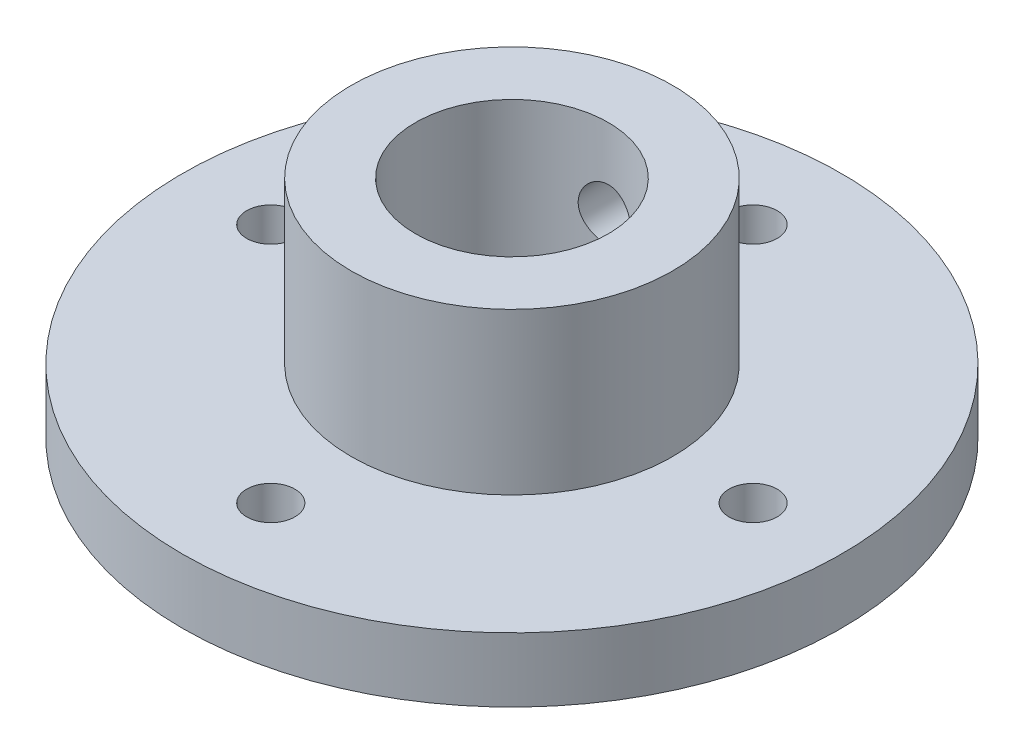
ISO-10303-21;
HEADER;
FILE_DESCRIPTION(('STEP AP214'),'2;1');
FILE_NAME('part.step','',(''),(''),'','','');
FILE_SCHEMA(('AUTOMOTIVE_DESIGN { 1 0 10303 214 1 1 1 1 }'));
ENDSEC;
DATA;
#1=APPLICATION_CONTEXT('core data for automotive mechanical design processes');
#2=APPLICATION_PROTOCOL_DEFINITION('international standard','automotive_design',2000,#1);
#3=PRODUCT_CONTEXT('',#1,'mechanical');
#4=PRODUCT('Part','Part','',(#3));
#5=PRODUCT_RELATED_PRODUCT_CATEGORY('part','',(#4));
#6=PRODUCT_DEFINITION_FORMATION('','',#4);
#7=PRODUCT_DEFINITION_CONTEXT('part definition',#1,'design');
#8=PRODUCT_DEFINITION('design','',#6,#7);
#9=PRODUCT_DEFINITION_SHAPE('','',#8);
#10=(LENGTH_UNIT() NAMED_UNIT(*) SI_UNIT(.MILLI.,.METRE.));
#11=(NAMED_UNIT(*) PLANE_ANGLE_UNIT() SI_UNIT($,.RADIAN.));
#12=(NAMED_UNIT(*) SI_UNIT($,.STERADIAN.) SOLID_ANGLE_UNIT());
#13=UNCERTAINTY_MEASURE_WITH_UNIT(LENGTH_MEASURE(1.E-05),#10,'distance_accuracy_value','');
#14=(GEOMETRIC_REPRESENTATION_CONTEXT(3) GLOBAL_UNCERTAINTY_ASSIGNED_CONTEXT((#13)) GLOBAL_UNIT_ASSIGNED_CONTEXT((#10,
#11,#12)) REPRESENTATION_CONTEXT('',''));
#15=CARTESIAN_POINT('',(0.,0.,0.));
#16=DIRECTION('',(0.,0.,1.));
#17=DIRECTION('',(1.,0.,0.));
#18=AXIS2_PLACEMENT_3D('',#15,#16,#17);
#19=CARTESIAN_POINT('',(0.,0.,-10.));
#20=DIRECTION('',(0.,-1.,0.));
#21=DIRECTION('',(0.,0.,-1.));
#22=AXIS2_PLACEMENT_3D('',#19,#20,#21);
#23=PLANE('',#22);
#24=CARTESIAN_POINT('',(0.,0.,0.));
#25=DIRECTION('',(0.,1.,0.));
#26=DIRECTION('',(0.,0.,1.));
#27=AXIS2_PLACEMENT_3D('',#24,#25,#26);
#28=CIRCLE('',#27,6.);
#29=CARTESIAN_POINT('',(0.,0.,6.));
#30=VERTEX_POINT('',#29);
#31=EDGE_CURVE('E10',#30,#30,#28,.T.);
#32=ORIENTED_EDGE('',*,*,#31,.F.);
#33=EDGE_LOOP('',(#32));
#34=FACE_BOUND('',#33,.T.);
#35=CARTESIAN_POINT('',(0.,0.,0.));
#36=DIRECTION('',(0.,1.,0.));
#37=DIRECTION('',(0.,0.,1.));
#38=AXIS2_PLACEMENT_3D('',#35,#36,#37);
#39=CIRCLE('',#38,10.);
#40=CARTESIAN_POINT('',(0.,0.,10.));
#41=VERTEX_POINT('',#40);
#42=EDGE_CURVE('E61',#41,#41,#39,.T.);
#43=ORIENTED_EDGE('',*,*,#42,.T.);
#44=EDGE_LOOP('',(#43));
#45=FACE_BOUND('',#44,.T.);
#46=ADVANCED_FACE('F39',(#34,#45),#23,.F.);
#47=CARTESIAN_POINT('',(0.,12.4624704371306,0.));
#48=DIRECTION('',(0.,1.,0.));
#49=DIRECTION('',(0.,0.,1.));
#50=AXIS2_PLACEMENT_3D('',#47,#48,#49);
#51=CYLINDRICAL_SURFACE('',#50,6.);
#52=CARTESIAN_POINT('',(-1.64999999999999,-5.,-5.76866535690883));
#53=CARTESIAN_POINT('',(-1.64999803744471,-4.90921955335826,-5.76866681542244));
#54=CARTESIAN_POINT('',(-1.64248258154127,-4.81841876938433,-5.77083168489651));
#55=CARTESIAN_POINT('',(-1.6126811316083,-4.63944729227742,-5.77922931898767));
#56=CARTESIAN_POINT('',(-1.59038833565188,-4.55127782986673,-5.78546395687622));
#57=CARTESIAN_POINT('',(-1.53182668713213,-4.38018421281183,-5.80124279590021));
#58=CARTESIAN_POINT('',(-1.49557833657747,-4.29725257039649,-5.81078214006462));
#59=CARTESIAN_POINT('',(-1.41019959185369,-4.1386327818451,-5.83208926824762));
#60=CARTESIAN_POINT('',(-1.36106796655277,-4.06294532891123,-5.84385726520744));
#61=CARTESIAN_POINT('',(-1.24991964518897,-3.91894953768283,-5.8686465288998));
#62=CARTESIAN_POINT('',(-1.18762153463159,-3.85086238877202,-5.88169112663028));
#63=CARTESIAN_POINT('',(-1.05251338107008,-3.72595879824099,-5.90736293037452));
#64=CARTESIAN_POINT('',(-0.97970219058191,-3.66914358854209,-5.91999009064059));
#65=CARTESIAN_POINT('',(-0.824091417921738,-3.56746519622699,-5.94366575662943));
#66=CARTESIAN_POINT('',(-0.741142186315799,-3.52282326362093,-5.9546835378627));
#67=CARTESIAN_POINT('',(-0.568561338575518,-3.44820386122524,-5.9736305376139));
#68=CARTESIAN_POINT('',(-0.47893092704165,-3.41822375527837,-5.98156031129505));
#69=CARTESIAN_POINT('',(-0.297842110789113,-3.37449875531736,-5.99327282902113));
#70=CARTESIAN_POINT('',(-0.206480953697204,-3.36037728398331,-5.99715160352105));
#71=CARTESIAN_POINT('',(-0.0226094627200603,-3.34758420132033,-6.00066142983201));
#72=CARTESIAN_POINT('',(0.0699006641776066,-3.34890984638382,-6.00029323595966));
#73=CARTESIAN_POINT('',(0.250818004668655,-3.36671114639084,-5.99542038051176));
#74=CARTESIAN_POINT('',(0.339268726185948,-3.38277972798329,-5.9910268682886));
#75=CARTESIAN_POINT('',(0.512166240031458,-3.42895138459311,-5.97872912336679));
#76=CARTESIAN_POINT('',(0.596612796751148,-3.45905528433459,-5.97082468436519));
#77=CARTESIAN_POINT('',(0.76012676990918,-3.53274614554669,-5.95223107363847));
#78=CARTESIAN_POINT('',(0.839129261966644,-3.57646980011385,-5.94151385162518));
#79=CARTESIAN_POINT('',(0.988812528588859,-3.67605339164663,-5.91844520458616));
#80=CARTESIAN_POINT('',(1.05949158844747,-3.73191582259505,-5.90609344393908));
#81=CARTESIAN_POINT('',(1.19295184933328,-3.85634061131932,-5.88061532945822));
#82=CARTESIAN_POINT('',(1.25540056574357,-3.92525754558751,-5.86747685059754));
#83=CARTESIAN_POINT('',(1.36793848619848,-4.07272042191697,-5.84226662316507));
#84=CARTESIAN_POINT('',(1.41802683438026,-4.15126703019764,-5.83019494849859));
#85=CARTESIAN_POINT('',(1.50469703763151,-4.31651707691904,-5.80843406835838));
#86=CARTESIAN_POINT('',(1.54118305341272,-4.40327318726382,-5.79876192329638));
#87=CARTESIAN_POINT('',(1.59894009136597,-4.5820216149048,-5.78310436235825));
#88=CARTESIAN_POINT('',(1.62021516432519,-4.67401253108294,-5.77711796499911));
#89=CARTESIAN_POINT('',(1.6463617832479,-4.85749641079511,-5.76972035320552));
#90=CARTESIAN_POINT('',(1.65173157694039,-4.94891284793571,-5.76817022285768));
#91=CARTESIAN_POINT('',(1.64729247824813,-5.13133853039988,-5.76943959387622));
#92=CARTESIAN_POINT('',(1.63748531887186,-5.2223478210242,-5.77225859634513));
#93=CARTESIAN_POINT('',(1.60341110080102,-5.39941887867532,-5.78181388299926));
#94=CARTESIAN_POINT('',(1.57944858294857,-5.48554414327791,-5.78846759511703));
#95=CARTESIAN_POINT('',(1.51808880834984,-5.6525516832155,-5.80486075000444));
#96=CARTESIAN_POINT('',(1.48068971625608,-5.73343324051216,-5.81460061430066));
#97=CARTESIAN_POINT('',(1.39252303885361,-5.8897280941801,-5.83634995588392));
#98=CARTESIAN_POINT('',(1.3414656422839,-5.96497115812137,-5.84840681329183));
#99=CARTESIAN_POINT('',(1.22778724402409,-6.10600436259986,-5.87332256443653));
#100=CARTESIAN_POINT('',(1.16516392562851,-6.17179260459153,-5.88618161851454));
#101=CARTESIAN_POINT('',(1.02781750590111,-6.29414335503752,-5.91173499394533));
#102=CARTESIAN_POINT('',(0.952779703449051,-6.35035698500714,-5.92441187573805));
#103=CARTESIAN_POINT('',(0.794045946471825,-6.44939303044249,-5.94776568995451));
#104=CARTESIAN_POINT('',(0.710350452233261,-6.49221615732852,-5.95844272861526));
#105=CARTESIAN_POINT('',(0.53726501835387,-6.56285441331322,-5.97652506377789));
#106=CARTESIAN_POINT('',(0.447923954411465,-6.59078270093573,-5.98395494908837));
#107=CARTESIAN_POINT('',(0.265580317975261,-6.63115951696826,-5.99481425560821));
#108=CARTESIAN_POINT('',(0.172578617937351,-6.64361171109341,-5.99824462414353));
#109=CARTESIAN_POINT('',(-0.0111958773090363,-6.65244119041157,-6.00067051691051));
#110=CARTESIAN_POINT('',(-0.101942634810784,-6.64932873226352,-5.99980681919578));
#111=CARTESIAN_POINT('',(-0.281569554656668,-6.6283104181902,-5.99406321514946));
#112=CARTESIAN_POINT('',(-0.370449795011795,-6.61040518179519,-5.98918347701204));
#113=CARTESIAN_POINT('',(-0.543165745839329,-6.56060523911145,-5.97598710157647));
#114=CARTESIAN_POINT('',(-0.627035168123876,-6.52881985190943,-5.9676973503156));
#115=CARTESIAN_POINT('',(-0.788297966420385,-6.45225916736823,-5.94854501555121));
#116=CARTESIAN_POINT('',(-0.865690389200812,-6.40748196231652,-5.93768205424174));
#117=CARTESIAN_POINT('',(-1.01415403207421,-6.30474796401359,-5.91416124461071));
#118=CARTESIAN_POINT('',(-1.08498744614407,-6.24645711073664,-5.90146164079605));
#119=CARTESIAN_POINT('',(-1.21603947801471,-6.1189762735603,-5.87585872928397));
#120=CARTESIAN_POINT('',(-1.27625523789271,-6.04978336464786,-5.86295536775691));
#121=CARTESIAN_POINT('',(-1.38578701268236,-5.90048219479949,-5.83805027961809));
#122=CARTESIAN_POINT('',(-1.43480949541505,-5.82015333678291,-5.82607732195824));
#123=CARTESIAN_POINT('',(-1.51858609627287,-5.65207439398107,-5.80480632889601));
#124=CARTESIAN_POINT('',(-1.55334897834328,-5.56432890757189,-5.79550665155144));
#125=CARTESIAN_POINT('',(-1.60340195745889,-5.39750366779767,-5.78183943348555));
#126=CARTESIAN_POINT('',(-1.62083357797552,-5.31910375198116,-5.77694065884767));
#127=CARTESIAN_POINT('',(-1.64413270596965,-5.16047435965551,-5.77035318708946));
#128=CARTESIAN_POINT('',(-1.65000173479532,-5.08024512524438,-5.76866406765974));
#129=CARTESIAN_POINT('',(-1.64999999999999,-5.,-5.76866535690883));
#130=B_SPLINE_CURVE_WITH_KNOTS('',3,(#52,#53,#54,#55,#56,#57,#58,#59,#60,#61,#62,#63,#64,#65,
#66,#67,#68,#69,#70,#71,#72,#73,#74,#75,#76,#77,#78,#79,#80,#81,#82,#83,#84,#85,#86,#87,#88,#89,
#90,#91,#92,#93,#94,#95,#96,#97,#98,#99,#100,#101,#102,#103,#104,#105,#106,#107,#108,#109,#110,
#111,#112,#113,#114,#115,#116,#117,#118,#119,#120,#121,#122,#123,#124,#125,#126,#127,#128,#129),
.UNSPECIFIED.,.T.,.F.,(4,2,2,2,2,2,2,2,2,2,2,2,2,2,2,2,2,2,2,2,2,2,2,2,2,2,2,2,2,2,2,2,2,2,2,2,
2,2,4),(0.,0.272046051104014,0.544217410515628,0.815990441281181,1.08778945227587,
1.36612384486571,1.64448864015853,1.92761862185041,2.21069767879603,2.48690242321261,
2.76305811084344,3.031810994421,3.30057967207717,3.57213780160765,3.84375177719014,
4.12421818647042,4.40470401050124,4.68713031851456,4.96948138625908,5.24288876991939,
5.51626493635488,5.78396348444835,6.05169861230968,6.32564040616626,6.59963713140789,
6.88212071608132,7.16458929021232,7.44488018041164,7.72510466738723,7.99620396443567,
8.26729190826136,8.53628224078237,8.80531209172666,9.08187822938623,9.35851869627824,
9.64174339988017,9.92479377192825,10.1652997746179,10.4057741306125),.UNSPECIFIED.);
#131=CARTESIAN_POINT('',(-1.64999999999999,-5.,-5.76866535690883));
#132=VERTEX_POINT('',#131);
#133=EDGE_CURVE('E96',#132,#132,#130,.T.);
#134=ORIENTED_EDGE('',*,*,#133,.T.);
#135=EDGE_LOOP('',(#134));
#136=FACE_BOUND('',#135,.T.);
#137=CARTESIAN_POINT('',(0.,-14.,0.));
#138=DIRECTION('',(0.,1.,0.));
#139=DIRECTION('',(0.,0.,1.));
#140=AXIS2_PLACEMENT_3D('',#137,#138,#139);
#141=CIRCLE('',#140,6.);
#142=CARTESIAN_POINT('',(0.,-14.,6.));
#143=VERTEX_POINT('',#142);
#144=EDGE_CURVE('E45',#143,#143,#141,.T.);
#145=ORIENTED_EDGE('',*,*,#144,.F.);
#146=EDGE_LOOP('',(#145));
#147=FACE_BOUND('',#146,.T.);
#148=ORIENTED_EDGE('',*,*,#31,.T.);
#149=EDGE_LOOP('',(#148));
#150=FACE_BOUND('',#149,.T.);
#151=ADVANCED_FACE('F133',(#136,#147,#150),#51,.F.);
#152=CARTESIAN_POINT('',(0.,-14.,-6.));
#153=DIRECTION('',(0.,1.,0.));
#154=DIRECTION('',(0.,0.,1.));
#155=AXIS2_PLACEMENT_3D('',#152,#153,#154);
#156=PLANE('',#155);
#157=CARTESIAN_POINT('',(0.,-14.,-15.));
#158=DIRECTION('',(0.,1.,0.));
#159=DIRECTION('',(0.,0.,1.));
#160=AXIS2_PLACEMENT_3D('',#157,#158,#159);
#161=CIRCLE('',#160,1.5);
#162=CARTESIAN_POINT('',(0.,-14.,-13.5));
#163=VERTEX_POINT('',#162);
#164=EDGE_CURVE('E64',#163,#163,#161,.F.);
#165=ORIENTED_EDGE('',*,*,#164,.F.);
#166=EDGE_LOOP('',(#165));
#167=FACE_BOUND('',#166,.T.);
#168=CARTESIAN_POINT('',(15.0000000000004,-14.,-3.6721662601683E-13));
#169=DIRECTION('',(0.,1.,0.));
#170=DIRECTION('',(0.,0.,1.));
#171=AXIS2_PLACEMENT_3D('',#168,#169,#170);
#172=CIRCLE('',#171,1.5);
#173=CARTESIAN_POINT('',(15.0000000000004,-14.,1.49999999999963));
#174=VERTEX_POINT('',#173);
#175=EDGE_CURVE('E79',#174,#174,#172,.F.);
#176=ORIENTED_EDGE('',*,*,#175,.F.);
#177=EDGE_LOOP('',(#176));
#178=FACE_BOUND('',#177,.T.);
#179=CARTESIAN_POINT('',(7.34433252033659E-13,-14.,15.));
#180=DIRECTION('',(0.,1.,0.));
#181=DIRECTION('',(0.,0.,1.));
#182=AXIS2_PLACEMENT_3D('',#179,#180,#181);
#183=CIRCLE('',#182,1.5);
#184=CARTESIAN_POINT('',(7.34433252033659E-13,-14.,16.5));
#185=VERTEX_POINT('',#184);
#186=EDGE_CURVE('E73',#185,#185,#183,.F.);
#187=ORIENTED_EDGE('',*,*,#186,.F.);
#188=EDGE_LOOP('',(#187));
#189=FACE_BOUND('',#188,.T.);
#190=CARTESIAN_POINT('',(-14.9999999999996,-14.,3.69053596215551E-13));
#191=DIRECTION('',(0.,1.,0.));
#192=DIRECTION('',(0.,0.,1.));
#193=AXIS2_PLACEMENT_3D('',#190,#191,#192);
#194=CIRCLE('',#193,1.5);
#195=CARTESIAN_POINT('',(-14.9999999999996,-14.,1.50000000000037));
#196=VERTEX_POINT('',#195);
#197=EDGE_CURVE('E65',#196,#196,#194,.F.);
#198=ORIENTED_EDGE('',*,*,#197,.F.);
#199=EDGE_LOOP('',(#198));
#200=FACE_BOUND('',#199,.T.);
#201=CARTESIAN_POINT('',(0.,-14.,0.));
#202=DIRECTION('',(0.,1.,0.));
#203=DIRECTION('',(0.,0.,1.));
#204=AXIS2_PLACEMENT_3D('',#201,#202,#203);
#205=CIRCLE('',#204,20.5);
#206=CARTESIAN_POINT('',(0.,-14.,20.5));
#207=VERTEX_POINT('',#206);
#208=EDGE_CURVE('E49',#207,#207,#205,.T.);
#209=ORIENTED_EDGE('',*,*,#208,.F.);
#210=EDGE_LOOP('',(#209));
#211=FACE_BOUND('',#210,.T.);
#212=ORIENTED_EDGE('',*,*,#144,.T.);
#213=EDGE_LOOP('',(#212));
#214=FACE_BOUND('',#213,.T.);
#215=ADVANCED_FACE('F138',(#167,#178,#189,#200,#211,#214),#156,.F.);
#216=CARTESIAN_POINT('',(0.,12.4624704371306,0.));
#217=DIRECTION('',(0.,1.,0.));
#218=DIRECTION('',(0.,0.,1.));
#219=AXIS2_PLACEMENT_3D('',#216,#217,#218);
#220=CYLINDRICAL_SURFACE('',#219,20.5);
#221=CARTESIAN_POINT('',(0.,-10.,0.));
#222=DIRECTION('',(0.,1.,0.));
#223=DIRECTION('',(0.,0.,1.));
#224=AXIS2_PLACEMENT_3D('',#221,#222,#223);
#225=CIRCLE('',#224,20.5);
#226=CARTESIAN_POINT('',(0.,-10.,20.5));
#227=VERTEX_POINT('',#226);
#228=EDGE_CURVE('E53',#227,#227,#225,.T.);
#229=ORIENTED_EDGE('',*,*,#228,.F.);
#230=EDGE_LOOP('',(#229));
#231=FACE_BOUND('',#230,.T.);
#232=ORIENTED_EDGE('',*,*,#208,.T.);
#233=EDGE_LOOP('',(#232));
#234=FACE_BOUND('',#233,.T.);
#235=ADVANCED_FACE('F148',(#231,#234),#220,.T.);
#236=CARTESIAN_POINT('',(0.,-10.,-20.5));
#237=DIRECTION('',(0.,-1.,0.));
#238=DIRECTION('',(0.,0.,-1.));
#239=AXIS2_PLACEMENT_3D('',#236,#237,#238);
#240=PLANE('',#239);
#241=CARTESIAN_POINT('',(0.,-10.,-15.));
#242=DIRECTION('',(0.,1.,0.));
#243=DIRECTION('',(0.,0.,1.));
#244=AXIS2_PLACEMENT_3D('',#241,#242,#243);
#245=CIRCLE('',#244,1.5);
#246=CARTESIAN_POINT('',(0.,-10.,-13.5));
#247=VERTEX_POINT('',#246);
#248=EDGE_CURVE('E82',#247,#247,#245,.T.);
#249=ORIENTED_EDGE('',*,*,#248,.F.);
#250=EDGE_LOOP('',(#249));
#251=FACE_BOUND('',#250,.T.);
#252=CARTESIAN_POINT('',(15.0000000000004,-10.,-3.6721662601683E-13));
#253=DIRECTION('',(0.,1.,0.));
#254=DIRECTION('',(0.,0.,1.));
#255=AXIS2_PLACEMENT_3D('',#252,#253,#254);
#256=CIRCLE('',#255,1.5);
#257=CARTESIAN_POINT('',(15.0000000000004,-10.,1.49999999999963));
#258=VERTEX_POINT('',#257);
#259=EDGE_CURVE('E76',#258,#258,#256,.T.);
#260=ORIENTED_EDGE('',*,*,#259,.F.);
#261=EDGE_LOOP('',(#260));
#262=FACE_BOUND('',#261,.T.);
#263=CARTESIAN_POINT('',(7.34433252033659E-13,-10.,15.));
#264=DIRECTION('',(0.,1.,0.));
#265=DIRECTION('',(0.,0.,1.));
#266=AXIS2_PLACEMENT_3D('',#263,#264,#265);
#267=CIRCLE('',#266,1.5);
#268=CARTESIAN_POINT('',(7.34433252033659E-13,-10.,16.5));
#269=VERTEX_POINT('',#268);
#270=EDGE_CURVE('E68',#269,#269,#267,.T.);
#271=ORIENTED_EDGE('',*,*,#270,.F.);
#272=EDGE_LOOP('',(#271));
#273=FACE_BOUND('',#272,.T.);
#274=CARTESIAN_POINT('',(-14.9999999999996,-10.,3.69053596215551E-13));
#275=DIRECTION('',(0.,1.,0.));
#276=DIRECTION('',(0.,0.,1.));
#277=AXIS2_PLACEMENT_3D('',#274,#275,#276);
#278=CIRCLE('',#277,1.5);
#279=CARTESIAN_POINT('',(-14.9999999999996,-10.,1.50000000000037));
#280=VERTEX_POINT('',#279);
#281=EDGE_CURVE('E69',#280,#280,#278,.T.);
#282=ORIENTED_EDGE('',*,*,#281,.F.);
#283=EDGE_LOOP('',(#282));
#284=FACE_BOUND('',#283,.T.);
#285=CARTESIAN_POINT('',(0.,-10.,0.));
#286=DIRECTION('',(0.,1.,0.));
#287=DIRECTION('',(0.,0.,1.));
#288=AXIS2_PLACEMENT_3D('',#285,#286,#287);
#289=CIRCLE('',#288,10.);
#290=CARTESIAN_POINT('',(0.,-10.,10.));
#291=VERTEX_POINT('',#290);
#292=EDGE_CURVE('E58',#291,#291,#289,.T.);
#293=ORIENTED_EDGE('',*,*,#292,.F.);
#294=EDGE_LOOP('',(#293));
#295=FACE_BOUND('',#294,.T.);
#296=ORIENTED_EDGE('',*,*,#228,.T.);
#297=EDGE_LOOP('',(#296));
#298=FACE_BOUND('',#297,.T.);
#299=ADVANCED_FACE('F129',(#251,#262,#273,#284,#295,#298),#240,.F.);
#300=CARTESIAN_POINT('',(0.,12.4624704371306,0.));
#301=DIRECTION('',(0.,1.,0.));
#302=DIRECTION('',(0.,0.,1.));
#303=AXIS2_PLACEMENT_3D('',#300,#301,#302);
#304=CYLINDRICAL_SURFACE('',#303,10.);
#305=CARTESIAN_POINT('',(-1.64999999999999,-5.,-9.86293566845085));
#306=CARTESIAN_POINT('',(-1.64999629098035,-5.09200184236589,-9.86293731785559));
#307=CARTESIAN_POINT('',(-1.6422790912311,-5.18405425704655,-9.86423691212933));
#308=CARTESIAN_POINT('',(-1.61162706431045,-5.36557721334189,-9.86929026153225));
#309=CARTESIAN_POINT('',(-1.58867811875356,-5.45504527914785,-9.8730462934991));
#310=CARTESIAN_POINT('',(-1.5282748949929,-5.62874617661554,-9.88257579035622));
#311=CARTESIAN_POINT('',(-1.49083263568619,-5.71298327917665,-9.888347583246));
#312=CARTESIAN_POINT('',(-1.40253539774319,-5.87397022447259,-9.90125628915054));
#313=CARTESIAN_POINT('',(-1.3516819635744,-5.95072092796823,-9.90839304494647));
#314=CARTESIAN_POINT('',(-1.23748166219591,-6.09530750245174,-9.92330460813677));
#315=CARTESIAN_POINT('',(-1.17403055174128,-6.16306053507082,-9.93108439980271));
#316=CARTESIAN_POINT('',(-1.03666129953611,-6.28700916572671,-9.94636114892747));
#317=CARTESIAN_POINT('',(-0.962742542660851,-6.34320408408188,-9.95385808973191));
#318=CARTESIAN_POINT('',(-0.806000158090801,-6.44275168341085,-9.96777711815929));
#319=CARTESIAN_POINT('',(-0.723126989054619,-6.48602735188961,-9.97419266457576));
#320=CARTESIAN_POINT('',(-0.55116410632525,-6.55801308877817,-9.98517060701297));
#321=CARTESIAN_POINT('',(-0.462074789289344,-6.58672408560593,-9.98973312115066));
#322=CARTESIAN_POINT('',(-0.281064093113009,-6.62851234663575,-9.99645574381605));
#323=CARTESIAN_POINT('',(-0.189175642116499,-6.64172874918627,-9.99863722113475));
#324=CARTESIAN_POINT('',(-0.00446128175041881,-6.65258525252394,-10.0004253754509));
#325=CARTESIAN_POINT('',(0.0883645646994437,-6.65022639190354,-10.0000322241302));
#326=CARTESIAN_POINT('',(0.271367618037819,-6.63010797229591,-9.9967323508907));
#327=CARTESIAN_POINT('',(0.361561789664353,-6.61249814818363,-9.99385006818958));
#328=CARTESIAN_POINT('',(0.537697224998584,-6.56261338129025,-9.98592303427217));
#329=CARTESIAN_POINT('',(0.623638361119398,-6.53033799885221,-9.98087821822582));
#330=CARTESIAN_POINT('',(0.789274301179362,-6.45188901844076,-9.96915130593382));
#331=CARTESIAN_POINT('',(0.868939282087191,-6.40565358203411,-9.96246194992932));
#332=CARTESIAN_POINT('',(1.01943645906903,-6.30064223705848,-9.94818939713311));
#333=CARTESIAN_POINT('',(1.09026795344527,-6.24186533324825,-9.94060612942547));
#334=CARTESIAN_POINT('',(1.22197197095425,-6.11260864280668,-9.92528291081511));
#335=CARTESIAN_POINT('',(1.28271604906533,-6.04199800126992,-9.9175421690508));
#336=CARTESIAN_POINT('',(1.3915146973154,-5.89151949674046,-9.90286372793618));
#337=CARTESIAN_POINT('',(1.43956915487057,-5.81165155162491,-9.89592603571092));
#338=CARTESIAN_POINT('',(1.5216488999909,-5.64477820621801,-9.88363886477132));
#339=CARTESIAN_POINT('',(1.5556589585636,-5.55776518006823,-9.87829111185157));
#340=CARTESIAN_POINT('',(1.60854450758026,-5.37915339971316,-9.86981807463769));
#341=CARTESIAN_POINT('',(1.62742130248434,-5.28755504147856,-9.86669259878991));
#342=CARTESIAN_POINT('',(1.64932410589817,-5.10352130492226,-9.86305497953646));
#343=CARTESIAN_POINT('',(1.65253310760669,-5.01110828243978,-9.86251266770398));
#344=CARTESIAN_POINT('',(1.6434966627856,-4.827065413365,-9.86402245062659));
#345=CARTESIAN_POINT('',(1.63125180079261,-4.73543553728247,-9.86607444725293));
#346=CARTESIAN_POINT('',(1.59181115051361,-4.55613978680088,-9.87251378234871));
#347=CARTESIAN_POINT('',(1.56470830150065,-4.46845290039821,-9.87688659832881));
#348=CARTESIAN_POINT('',(1.49641841835945,-4.29886579240696,-9.88746270071879));
#349=CARTESIAN_POINT('',(1.45523055679537,-4.21696591112197,-9.89366609466455));
#350=CARTESIAN_POINT('',(1.35950711966144,-4.06046261082452,-9.90727458613197));
#351=CARTESIAN_POINT('',(1.30485415292749,-3.98593191012952,-9.91469004820881));
#352=CARTESIAN_POINT('',(1.18391324175599,-3.84703397493109,-9.92985673064713));
#353=CARTESIAN_POINT('',(1.11762449587139,-3.78266744109376,-9.93760797410877));
#354=CARTESIAN_POINT('',(0.974483484791722,-3.66525790191988,-9.95266815580003));
#355=CARTESIAN_POINT('',(0.897530542660926,-3.61233685423421,-9.95997178743297));
#356=CARTESIAN_POINT('',(0.735720107735901,-3.52017429434235,-9.9732289669924));
#357=CARTESIAN_POINT('',(0.650862866786061,-3.48093234648558,-9.97918255791273));
#358=CARTESIAN_POINT('',(0.476016852877788,-3.4174322356549,-9.98904576356827));
#359=CARTESIAN_POINT('',(0.386051879990877,-3.39310995470236,-9.99296411355053));
#360=CARTESIAN_POINT('',(0.203244410238656,-3.35993302639989,-9.99835224840596));
#361=CARTESIAN_POINT('',(0.110402145843635,-3.35107713274443,-9.99982223057197));
#362=CARTESIAN_POINT('',(-0.0743467418035983,-3.34911966067286,-10.000145298838));
#363=CARTESIAN_POINT('',(-0.166251396930959,-3.35583241214439,-9.99902922611947));
#364=CARTESIAN_POINT('',(-0.347605270735729,-3.38442046191204,-9.99436846725468));
#365=CARTESIAN_POINT('',(-0.437054502497682,-3.40629567939358,-9.99082379405268));
#366=CARTESIAN_POINT('',(-0.610889563964934,-3.46451700740677,-9.98170266675398));
#367=CARTESIAN_POINT('',(-0.695280700367391,-3.50084763505875,-9.97612838706588));
#368=CARTESIAN_POINT('',(-0.856798143174385,-3.58692791213137,-9.96355694814414));
#369=CARTESIAN_POINT('',(-0.933924116084172,-3.63667817715261,-9.95655972363921));
#370=CARTESIAN_POINT('',(-1.07965789685337,-3.74884509993872,-9.94181931422729));
#371=CARTESIAN_POINT('',(-1.14816021705335,-3.81139784214903,-9.93406862876239));
#372=CARTESIAN_POINT('',(-1.27376166628459,-3.94710837219217,-9.91874715128115));
#373=CARTESIAN_POINT('',(-1.3308581205858,-4.02026864061507,-9.91117640182652));
#374=CARTESIAN_POINT('',(-1.43238917357862,-4.17571782576934,-9.8970154548119));
#375=CARTESIAN_POINT('',(-1.47673345800304,-4.25806638528068,-9.89043240198641));
#376=CARTESIAN_POINT('',(-1.55089189624868,-4.42911803701398,-9.8790765640257));
#377=CARTESIAN_POINT('',(-1.58072062483371,-4.51781465218412,-9.87430196413345));
#378=CARTESIAN_POINT('',(-1.61849251524498,-4.67238529953625,-9.86816715424855));
#379=CARTESIAN_POINT('',(-1.63028895802673,-4.73732136502587,-9.86621620214802));
#380=CARTESIAN_POINT('',(-1.64604396057965,-4.86816297436923,-9.86359987952975));
#381=CARTESIAN_POINT('',(-1.65000265800355,-4.93406850117604,-9.86293448643402));
#382=CARTESIAN_POINT('',(-1.64999999999999,-5.,-9.86293566845085));
#383=B_SPLINE_CURVE_WITH_KNOTS('',3,(#305,#306,#307,#308,#309,#310,#311,#312,#313,#314,#315,
#316,#317,#318,#319,#320,#321,#322,#323,#324,#325,#326,#327,#328,#329,#330,#331,#332,#333,#334,
#335,#336,#337,#338,#339,#340,#341,#342,#343,#344,#345,#346,#347,#348,#349,#350,#351,#352,#353,
#354,#355,#356,#357,#358,#359,#360,#361,#362,#363,#364,#365,#366,#367,#368,#369,#370,#371,#372,
#373,#374,#375,#376,#377,#378,#379,#380,#381,#382),.UNSPECIFIED.,.T.,.F.,(4,2,2,2,2,2,2,2,2,2,2,
2,2,2,2,2,2,2,2,2,2,2,2,2,2,2,2,2,2,2,2,2,2,2,2,2,2,2,4),(0.,0.275764439202392,
0.551784843546745,0.827576840629569,1.10333709061228,1.38148219258882,1.65964364637685,
1.93943156735329,2.21920165114179,2.49643973106727,2.77365932434103,3.04818762343249,
3.32272415311683,3.59849508924514,3.87428791760821,4.15336037881897,4.43243531591038,
4.71181207725746,4.99116475423997,5.26724677423092,5.54331835183576,5.81768243813564,
6.09206264495275,6.36892529029639,6.6458070128228,6.92550769092012,7.20519946032491,
7.48368066222355,7.76213942263835,8.03729441534006,8.31244794150175,8.58730754656385,
8.86217976243817,9.14014153059554,9.41816840579299,9.69811840194758,9.97778672322848,
10.175411919191,10.3730336442719),.UNSPECIFIED.);
#384=CARTESIAN_POINT('',(-1.64999999999999,-5.,-9.86293566845085));
#385=VERTEX_POINT('',#384);
#386=EDGE_CURVE('E72',#385,#385,#383,.T.);
#387=ORIENTED_EDGE('',*,*,#386,.T.);
#388=EDGE_LOOP('',(#387));
#389=FACE_BOUND('',#388,.T.);
#390=ORIENTED_EDGE('',*,*,#42,.F.);
#391=EDGE_LOOP('',(#390));
#392=FACE_BOUND('',#391,.T.);
#393=ORIENTED_EDGE('',*,*,#292,.T.);
#394=EDGE_LOOP('',(#393));
#395=FACE_BOUND('',#394,.T.);
#396=ADVANCED_FACE('F101',(#389,#392,#395),#304,.T.);
#397=CARTESIAN_POINT('',(-14.9999999999996,-14.001,3.69053596215551E-13));
#398=DIRECTION('',(0.,1.,0.));
#399=DIRECTION('',(0.,0.,1.));
#400=AXIS2_PLACEMENT_3D('',#397,#398,#399);
#401=CYLINDRICAL_SURFACE('',#400,1.5);
#402=ORIENTED_EDGE('',*,*,#281,.T.);
#403=EDGE_LOOP('',(#402));
#404=FACE_BOUND('',#403,.T.);
#405=ORIENTED_EDGE('',*,*,#197,.T.);
#406=EDGE_LOOP('',(#405));
#407=FACE_BOUND('',#406,.T.);
#408=ADVANCED_FACE('F122',(#404,#407),#401,.F.);
#409=CARTESIAN_POINT('',(7.34433252033659E-13,-14.001,15.));
#410=DIRECTION('',(0.,1.,0.));
#411=DIRECTION('',(0.,0.,1.));
#412=AXIS2_PLACEMENT_3D('',#409,#410,#411);
#413=CYLINDRICAL_SURFACE('',#412,1.5);
#414=ORIENTED_EDGE('',*,*,#270,.T.);
#415=EDGE_LOOP('',(#414));
#416=FACE_BOUND('',#415,.T.);
#417=ORIENTED_EDGE('',*,*,#186,.T.);
#418=EDGE_LOOP('',(#417));
#419=FACE_BOUND('',#418,.T.);
#420=ADVANCED_FACE('F119',(#416,#419),#413,.F.);
#421=CARTESIAN_POINT('',(15.0000000000004,-14.001,-3.6721662601683E-13));
#422=DIRECTION('',(0.,1.,0.));
#423=DIRECTION('',(0.,0.,1.));
#424=AXIS2_PLACEMENT_3D('',#421,#422,#423);
#425=CYLINDRICAL_SURFACE('',#424,1.5);
#426=ORIENTED_EDGE('',*,*,#259,.T.);
#427=EDGE_LOOP('',(#426));
#428=FACE_BOUND('',#427,.T.);
#429=ORIENTED_EDGE('',*,*,#175,.T.);
#430=EDGE_LOOP('',(#429));
#431=FACE_BOUND('',#430,.T.);
#432=ADVANCED_FACE('F115',(#428,#431),#425,.F.);
#433=CARTESIAN_POINT('',(0.,-14.001,-15.));
#434=DIRECTION('',(0.,1.,0.));
#435=DIRECTION('',(0.,0.,1.));
#436=AXIS2_PLACEMENT_3D('',#433,#434,#435);
#437=CYLINDRICAL_SURFACE('',#436,1.5);
#438=ORIENTED_EDGE('',*,*,#248,.T.);
#439=EDGE_LOOP('',(#438));
#440=FACE_BOUND('',#439,.T.);
#441=ORIENTED_EDGE('',*,*,#164,.T.);
#442=EDGE_LOOP('',(#441));
#443=FACE_BOUND('',#442,.T.);
#444=ADVANCED_FACE('F108',(#440,#443),#437,.F.);
#445=CARTESIAN_POINT('',(0.,-5.,-10.));
#446=DIRECTION('',(0.,0.,-1.));
#447=DIRECTION('',(-1.,0.,0.));
#448=AXIS2_PLACEMENT_3D('',#445,#446,#447);
#449=CYLINDRICAL_SURFACE('',#448,1.64999999999999);
#450=ORIENTED_EDGE('',*,*,#133,.F.);
#451=EDGE_LOOP('',(#450));
#452=FACE_BOUND('',#451,.T.);
#453=ORIENTED_EDGE('',*,*,#386,.F.);
#454=EDGE_LOOP('',(#453));
#455=FACE_BOUND('',#454,.T.);
#456=ADVANCED_FACE('F105',(#452,#455),#449,.F.);
#457=CLOSED_SHELL('',(#46,#151,#215,#235,#299,#396,#408,#420,#432,#444,#456));
#458=MANIFOLD_SOLID_BREP('B2',#457);
#459=ADVANCED_BREP_SHAPE_REPRESENTATION('',(#18,#458),#14);
#460=SHAPE_DEFINITION_REPRESENTATION(#9,#459);
ENDSEC;
END-ISO-10303-21;
